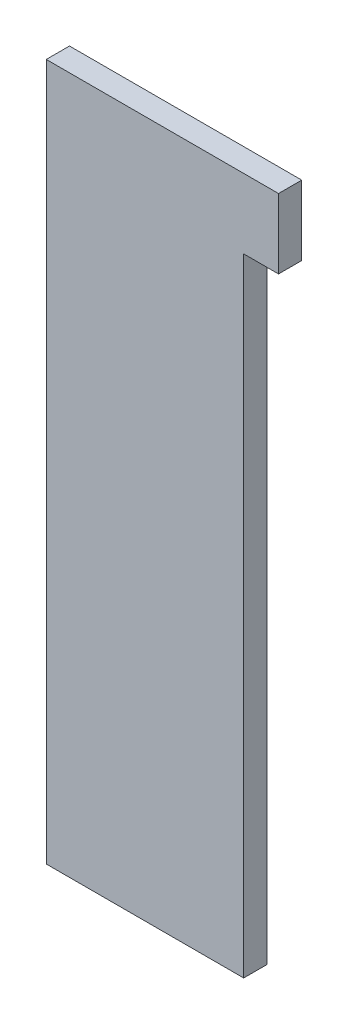
ISO-10303-21;
HEADER;
FILE_DESCRIPTION(('STEP AP214'),'2;1');
FILE_NAME('part.step','',(''),(''),'','','');
FILE_SCHEMA(('AUTOMOTIVE_DESIGN { 1 0 10303 214 1 1 1 1 }'));
ENDSEC;
DATA;
#1=APPLICATION_CONTEXT('core data for automotive mechanical design processes');
#2=APPLICATION_PROTOCOL_DEFINITION('international standard','automotive_design',2000,#1);
#3=PRODUCT_CONTEXT('',#1,'mechanical');
#4=PRODUCT('Part','Part','',(#3));
#5=PRODUCT_RELATED_PRODUCT_CATEGORY('part','',(#4));
#6=PRODUCT_DEFINITION_FORMATION('','',#4);
#7=PRODUCT_DEFINITION_CONTEXT('part definition',#1,'design');
#8=PRODUCT_DEFINITION('design','',#6,#7);
#9=PRODUCT_DEFINITION_SHAPE('','',#8);
#10=(LENGTH_UNIT() NAMED_UNIT(*) SI_UNIT(.MILLI.,.METRE.));
#11=(NAMED_UNIT(*) PLANE_ANGLE_UNIT() SI_UNIT($,.RADIAN.));
#12=(NAMED_UNIT(*) SI_UNIT($,.STERADIAN.) SOLID_ANGLE_UNIT());
#13=UNCERTAINTY_MEASURE_WITH_UNIT(LENGTH_MEASURE(1.E-05),#10,'distance_accuracy_value','');
#14=(GEOMETRIC_REPRESENTATION_CONTEXT(3) GLOBAL_UNCERTAINTY_ASSIGNED_CONTEXT((#13)) GLOBAL_UNIT_ASSIGNED_CONTEXT((#10,
#11,#12)) REPRESENTATION_CONTEXT('',''));
#15=CARTESIAN_POINT('',(0.,0.,0.));
#16=DIRECTION('',(0.,0.,1.));
#17=DIRECTION('',(1.,0.,0.));
#18=AXIS2_PLACEMENT_3D('',#15,#16,#17);
#19=CARTESIAN_POINT('',(0.,0.,2.));
#20=DIRECTION('',(1.,0.,0.));
#21=DIRECTION('',(0.,0.,-1.));
#22=AXIS2_PLACEMENT_3D('',#19,#20,#21);
#23=PLANE('',#22);
#24=DIRECTION('',(0.,-1.,0.));
#25=VECTOR('',#24,1.);
#26=CARTESIAN_POINT('',(0.,0.,0.));
#27=LINE('',#26,#25);
#28=CARTESIAN_POINT('',(0.,60.,0.));
#29=VERTEX_POINT('',#28);
#30=CARTESIAN_POINT('',(0.,0.,0.));
#31=VERTEX_POINT('',#30);
#32=EDGE_CURVE('E118',#29,#31,#27,.T.);
#33=ORIENTED_EDGE('',*,*,#32,.T.);
#34=DIRECTION('',(0.,0.,-1.));
#35=VECTOR('',#34,1.);
#36=CARTESIAN_POINT('',(0.,0.,2.));
#37=LINE('',#36,#35);
#38=CARTESIAN_POINT('',(0.,0.,2.));
#39=VERTEX_POINT('',#38);
#40=EDGE_CURVE('E11',#39,#31,#37,.T.);
#41=ORIENTED_EDGE('',*,*,#40,.F.);
#42=DIRECTION('',(0.,-1.,0.));
#43=VECTOR('',#42,1.);
#44=CARTESIAN_POINT('',(0.,0.,2.));
#45=LINE('',#44,#43);
#46=CARTESIAN_POINT('',(0.,60.,2.));
#47=VERTEX_POINT('',#46);
#48=EDGE_CURVE('E129',#47,#39,#45,.T.);
#49=ORIENTED_EDGE('',*,*,#48,.F.);
#50=DIRECTION('',(0.,0.,-1.));
#51=VECTOR('',#50,1.);
#52=CARTESIAN_POINT('',(0.,60.,2.));
#53=LINE('',#52,#51);
#54=EDGE_CURVE('E114',#47,#29,#53,.T.);
#55=ORIENTED_EDGE('',*,*,#54,.T.);
#56=EDGE_LOOP('',(#33,#41,#49,#55));
#57=FACE_BOUND('',#56,.T.);
#58=ADVANCED_FACE('F33',(#57),#23,.F.);
#59=CARTESIAN_POINT('',(0.,0.,2.));
#60=DIRECTION('',(0.,1.,0.));
#61=DIRECTION('',(0.,0.,1.));
#62=AXIS2_PLACEMENT_3D('',#59,#60,#61);
#63=PLANE('',#62);
#64=DIRECTION('',(1.,0.,0.));
#65=VECTOR('',#64,1.);
#66=CARTESIAN_POINT('',(0.,0.,0.));
#67=LINE('',#66,#65);
#68=CARTESIAN_POINT('',(17.,0.,0.));
#69=VERTEX_POINT('',#68);
#70=EDGE_CURVE('E121',#31,#69,#67,.T.);
#71=ORIENTED_EDGE('',*,*,#70,.T.);
#72=DIRECTION('',(0.,0.,-1.));
#73=VECTOR('',#72,1.);
#74=CARTESIAN_POINT('',(17.,0.,2.));
#75=LINE('',#74,#73);
#76=CARTESIAN_POINT('',(17.,0.,2.));
#77=VERTEX_POINT('',#76);
#78=EDGE_CURVE('E41',#77,#69,#75,.T.);
#79=ORIENTED_EDGE('',*,*,#78,.F.);
#80=DIRECTION('',(1.,0.,0.));
#81=VECTOR('',#80,1.);
#82=CARTESIAN_POINT('',(0.,0.,2.));
#83=LINE('',#82,#81);
#84=EDGE_CURVE('E84',#39,#77,#83,.T.);
#85=ORIENTED_EDGE('',*,*,#84,.F.);
#86=ORIENTED_EDGE('',*,*,#40,.T.);
#87=EDGE_LOOP('',(#71,#79,#85,#86));
#88=FACE_BOUND('',#87,.T.);
#89=ADVANCED_FACE('F143',(#88),#63,.F.);
#90=CARTESIAN_POINT('',(17.,0.,2.));
#91=DIRECTION('',(-1.,0.,0.));
#92=DIRECTION('',(0.,0.,1.));
#93=AXIS2_PLACEMENT_3D('',#90,#91,#92);
#94=PLANE('',#93);
#95=DIRECTION('',(0.,1.,0.));
#96=VECTOR('',#95,1.);
#97=CARTESIAN_POINT('',(17.,0.,0.));
#98=LINE('',#97,#96);
#99=CARTESIAN_POINT('',(17.,54.,0.));
#100=VERTEX_POINT('',#99);
#101=EDGE_CURVE('E123',#69,#100,#98,.T.);
#102=ORIENTED_EDGE('',*,*,#101,.T.);
#103=DIRECTION('',(0.,0.,-1.));
#104=VECTOR('',#103,1.);
#105=CARTESIAN_POINT('',(17.,54.,2.));
#106=LINE('',#105,#104);
#107=CARTESIAN_POINT('',(17.,54.,2.));
#108=VERTEX_POINT('',#107);
#109=EDGE_CURVE('E109',#108,#100,#106,.T.);
#110=ORIENTED_EDGE('',*,*,#109,.F.);
#111=DIRECTION('',(0.,1.,0.));
#112=VECTOR('',#111,1.);
#113=CARTESIAN_POINT('',(17.,0.,2.));
#114=LINE('',#113,#112);
#115=EDGE_CURVE('E98',#77,#108,#114,.T.);
#116=ORIENTED_EDGE('',*,*,#115,.F.);
#117=ORIENTED_EDGE('',*,*,#78,.T.);
#118=EDGE_LOOP('',(#102,#110,#116,#117));
#119=FACE_BOUND('',#118,.T.);
#120=ADVANCED_FACE('F135',(#119),#94,.F.);
#121=CARTESIAN_POINT('',(17.,54.,2.));
#122=DIRECTION('',(0.,1.,0.));
#123=DIRECTION('',(0.,0.,1.));
#124=AXIS2_PLACEMENT_3D('',#121,#122,#123);
#125=PLANE('',#124);
#126=DIRECTION('',(1.,0.,0.));
#127=VECTOR('',#126,1.);
#128=CARTESIAN_POINT('',(17.,54.,0.));
#129=LINE('',#128,#127);
#130=CARTESIAN_POINT('',(20.,54.,0.));
#131=VERTEX_POINT('',#130);
#132=EDGE_CURVE('E107',#100,#131,#129,.T.);
#133=ORIENTED_EDGE('',*,*,#132,.T.);
#134=DIRECTION('',(0.,0.,-1.));
#135=VECTOR('',#134,1.);
#136=CARTESIAN_POINT('',(20.,54.,2.));
#137=LINE('',#136,#135);
#138=CARTESIAN_POINT('',(20.,54.,2.));
#139=VERTEX_POINT('',#138);
#140=EDGE_CURVE('E104',#139,#131,#137,.T.);
#141=ORIENTED_EDGE('',*,*,#140,.F.);
#142=DIRECTION('',(1.,0.,0.));
#143=VECTOR('',#142,1.);
#144=CARTESIAN_POINT('',(17.,54.,2.));
#145=LINE('',#144,#143);
#146=EDGE_CURVE('E91',#108,#139,#145,.T.);
#147=ORIENTED_EDGE('',*,*,#146,.F.);
#148=ORIENTED_EDGE('',*,*,#109,.T.);
#149=EDGE_LOOP('',(#133,#141,#147,#148));
#150=FACE_BOUND('',#149,.T.);
#151=ADVANCED_FACE('F105',(#150),#125,.F.);
#152=CARTESIAN_POINT('',(20.,60.,2.));
#153=DIRECTION('',(-1.,0.,0.));
#154=DIRECTION('',(0.,0.,1.));
#155=AXIS2_PLACEMENT_3D('',#152,#153,#154);
#156=PLANE('',#155);
#157=DIRECTION('',(0.,1.,0.));
#158=VECTOR('',#157,1.);
#159=CARTESIAN_POINT('',(20.,60.,0.));
#160=LINE('',#159,#158);
#161=CARTESIAN_POINT('',(20.,60.,0.));
#162=VERTEX_POINT('',#161);
#163=EDGE_CURVE('E126',#131,#162,#160,.T.);
#164=ORIENTED_EDGE('',*,*,#163,.T.);
#165=DIRECTION('',(0.,0.,-1.));
#166=VECTOR('',#165,1.);
#167=CARTESIAN_POINT('',(20.,60.,2.));
#168=LINE('',#167,#166);
#169=CARTESIAN_POINT('',(20.,60.,2.));
#170=VERTEX_POINT('',#169);
#171=EDGE_CURVE('E110',#170,#162,#168,.T.);
#172=ORIENTED_EDGE('',*,*,#171,.F.);
#173=DIRECTION('',(0.,1.,0.));
#174=VECTOR('',#173,1.);
#175=CARTESIAN_POINT('',(20.,60.,2.));
#176=LINE('',#175,#174);
#177=EDGE_CURVE('E95',#139,#170,#176,.T.);
#178=ORIENTED_EDGE('',*,*,#177,.F.);
#179=ORIENTED_EDGE('',*,*,#140,.T.);
#180=EDGE_LOOP('',(#164,#172,#178,#179));
#181=FACE_BOUND('',#180,.T.);
#182=ADVANCED_FACE('F112',(#181),#156,.F.);
#183=CARTESIAN_POINT('',(0.,60.,2.));
#184=DIRECTION('',(0.,-1.,0.));
#185=DIRECTION('',(0.,0.,-1.));
#186=AXIS2_PLACEMENT_3D('',#183,#184,#185);
#187=PLANE('',#186);
#188=DIRECTION('',(-1.,0.,0.));
#189=VECTOR('',#188,1.);
#190=CARTESIAN_POINT('',(0.,60.,0.));
#191=LINE('',#190,#189);
#192=EDGE_CURVE('E72',#162,#29,#191,.T.);
#193=ORIENTED_EDGE('',*,*,#192,.T.);
#194=ORIENTED_EDGE('',*,*,#54,.F.);
#195=DIRECTION('',(-1.,0.,0.));
#196=VECTOR('',#195,1.);
#197=CARTESIAN_POINT('',(16.5671641791045,60.,2.));
#198=LINE('',#197,#196);
#199=EDGE_CURVE('E49',#170,#47,#198,.T.);
#200=ORIENTED_EDGE('',*,*,#199,.F.);
#201=ORIENTED_EDGE('',*,*,#171,.T.);
#202=EDGE_LOOP('',(#193,#194,#200,#201));
#203=FACE_BOUND('',#202,.T.);
#204=ADVANCED_FACE('F137',(#203),#187,.F.);
#205=CARTESIAN_POINT('',(0.,0.,2.));
#206=DIRECTION('',(0.,0.,-1.));
#207=DIRECTION('',(-1.,0.,0.));
#208=AXIS2_PLACEMENT_3D('',#205,#206,#207);
#209=PLANE('',#208);
#210=ORIENTED_EDGE('',*,*,#48,.T.);
#211=ORIENTED_EDGE('',*,*,#84,.T.);
#212=ORIENTED_EDGE('',*,*,#115,.T.);
#213=ORIENTED_EDGE('',*,*,#146,.T.);
#214=ORIENTED_EDGE('',*,*,#177,.T.);
#215=ORIENTED_EDGE('',*,*,#199,.T.);
#216=EDGE_LOOP('',(#210,#211,#212,#213,#214,#215));
#217=FACE_BOUND('',#216,.T.);
#218=ADVANCED_FACE('F93',(#217),#209,.F.);
#219=CARTESIAN_POINT('',(0.,0.,0.));
#220=DIRECTION('',(0.,0.,-1.));
#221=DIRECTION('',(-1.,0.,0.));
#222=AXIS2_PLACEMENT_3D('',#219,#220,#221);
#223=PLANE('',#222);
#224=ORIENTED_EDGE('',*,*,#32,.F.);
#225=ORIENTED_EDGE('',*,*,#192,.F.);
#226=ORIENTED_EDGE('',*,*,#163,.F.);
#227=ORIENTED_EDGE('',*,*,#132,.F.);
#228=ORIENTED_EDGE('',*,*,#101,.F.);
#229=ORIENTED_EDGE('',*,*,#70,.F.);
#230=EDGE_LOOP('',(#224,#225,#226,#227,#228,#229));
#231=FACE_BOUND('',#230,.T.);
#232=ADVANCED_FACE('F136',(#231),#223,.T.);
#233=CLOSED_SHELL('',(#58,#89,#120,#151,#182,#204,#218,#232));
#234=MANIFOLD_SOLID_BREP('B2',#233);
#235=ADVANCED_BREP_SHAPE_REPRESENTATION('',(#18,#234),#14);
#236=SHAPE_DEFINITION_REPRESENTATION(#9,#235);
ENDSEC;
END-ISO-10303-21;
